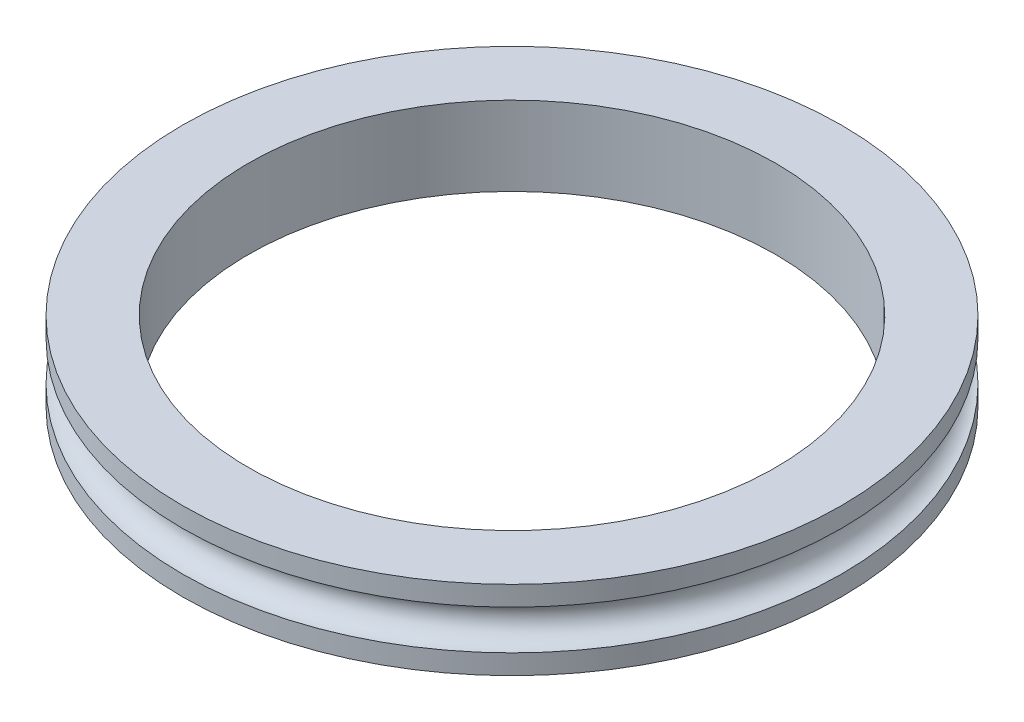
ISO-10303-21;
HEADER;
FILE_DESCRIPTION(('STEP AP214'),'2;1');
FILE_NAME('part.step','',(''),(''),'','','');
FILE_SCHEMA(('AUTOMOTIVE_DESIGN { 1 0 10303 214 1 1 1 1 }'));
ENDSEC;
DATA;
#1=APPLICATION_CONTEXT('core data for automotive mechanical design processes');
#2=APPLICATION_PROTOCOL_DEFINITION('international standard','automotive_design',2000,#1);
#3=PRODUCT_CONTEXT('',#1,'mechanical');
#4=PRODUCT('Part','Part','',(#3));
#5=PRODUCT_RELATED_PRODUCT_CATEGORY('part','',(#4));
#6=PRODUCT_DEFINITION_FORMATION('','',#4);
#7=PRODUCT_DEFINITION_CONTEXT('part definition',#1,'design');
#8=PRODUCT_DEFINITION('design','',#6,#7);
#9=PRODUCT_DEFINITION_SHAPE('','',#8);
#10=(LENGTH_UNIT() NAMED_UNIT(*) SI_UNIT(.MILLI.,.METRE.));
#11=(NAMED_UNIT(*) PLANE_ANGLE_UNIT() SI_UNIT($,.RADIAN.));
#12=(NAMED_UNIT(*) SI_UNIT($,.STERADIAN.) SOLID_ANGLE_UNIT());
#13=UNCERTAINTY_MEASURE_WITH_UNIT(LENGTH_MEASURE(1.E-05),#10,'distance_accuracy_value','');
#14=(GEOMETRIC_REPRESENTATION_CONTEXT(3) GLOBAL_UNCERTAINTY_ASSIGNED_CONTEXT((#13)) GLOBAL_UNIT_ASSIGNED_CONTEXT((#10,
#11,#12)) REPRESENTATION_CONTEXT('',''));
#15=CARTESIAN_POINT('',(0.,0.,0.));
#16=DIRECTION('',(0.,0.,1.));
#17=DIRECTION('',(1.,0.,0.));
#18=AXIS2_PLACEMENT_3D('',#15,#16,#17);
#19=CARTESIAN_POINT('',(0.,1.5,0.));
#20=DIRECTION('',(0.,-1.,0.));
#21=DIRECTION('',(0.,0.,-1.));
#22=AXIS2_PLACEMENT_3D('',#19,#20,#21);
#23=CYLINDRICAL_SURFACE('',#22,12.5);
#24=CARTESIAN_POINT('',(0.,1.5,0.));
#25=DIRECTION('',(0.,1.,0.));
#26=DIRECTION('',(0.,0.,1.));
#27=AXIS2_PLACEMENT_3D('',#24,#25,#26);
#28=CIRCLE('',#27,12.5);
#29=CARTESIAN_POINT('',(0.,1.5,12.5));
#30=VERTEX_POINT('',#29);
#31=EDGE_CURVE('E10',#30,#30,#28,.T.);
#32=ORIENTED_EDGE('',*,*,#31,.F.);
#33=EDGE_LOOP('',(#32));
#34=FACE_BOUND('',#33,.T.);
#35=CARTESIAN_POINT('',(0.,0.750000000000001,0.));
#36=DIRECTION('',(0.,-1.,0.));
#37=DIRECTION('',(0.,0.,-1.));
#38=AXIS2_PLACEMENT_3D('',#35,#36,#37);
#39=CIRCLE('',#38,12.5);
#40=CARTESIAN_POINT('',(0.,0.750000000000001,-12.5));
#41=VERTEX_POINT('',#40);
#42=EDGE_CURVE('E34',#41,#41,#39,.T.);
#43=ORIENTED_EDGE('',*,*,#42,.F.);
#44=EDGE_LOOP('',(#43));
#45=FACE_BOUND('',#44,.T.);
#46=ADVANCED_FACE('F31',(#34,#45),#23,.T.);
#47=CARTESIAN_POINT('',(0.,1.5,0.));
#48=DIRECTION('',(0.,1.,0.));
#49=DIRECTION('',(0.,0.,1.));
#50=AXIS2_PLACEMENT_3D('',#47,#48,#49);
#51=PLANE('',#50);
#52=CARTESIAN_POINT('',(0.,1.5,0.));
#53=DIRECTION('',(0.,-1.,0.));
#54=DIRECTION('',(0.,0.,-1.));
#55=AXIS2_PLACEMENT_3D('',#52,#53,#54);
#56=CIRCLE('',#55,10.);
#57=CARTESIAN_POINT('',(0.,1.5,-10.));
#58=VERTEX_POINT('',#57);
#59=EDGE_CURVE('E49',#58,#58,#56,.T.);
#60=ORIENTED_EDGE('',*,*,#59,.T.);
#61=EDGE_LOOP('',(#60));
#62=FACE_BOUND('',#61,.T.);
#63=ORIENTED_EDGE('',*,*,#31,.T.);
#64=EDGE_LOOP('',(#63));
#65=FACE_BOUND('',#64,.T.);
#66=ADVANCED_FACE('F76',(#62,#65),#51,.T.);
#67=CARTESIAN_POINT('',(0.,0.,0.));
#68=DIRECTION('',(0.,1.,0.));
#69=DIRECTION('',(0.,0.,1.));
#70=AXIS2_PLACEMENT_3D('',#67,#68,#69);
#71=TOROIDAL_SURFACE('',#70,12.5,0.75);
#72=CARTESIAN_POINT('',(0.,-0.75,0.));
#73=DIRECTION('',(0.,1.,0.));
#74=DIRECTION('',(0.,0.,1.));
#75=AXIS2_PLACEMENT_3D('',#72,#73,#74);
#76=CIRCLE('',#75,12.5);
#77=CARTESIAN_POINT('',(0.,-0.75,12.5));
#78=VERTEX_POINT('',#77);
#79=EDGE_CURVE('E47',#78,#78,#76,.T.);
#80=ORIENTED_EDGE('',*,*,#79,.T.);
#81=EDGE_LOOP('',(#80));
#82=FACE_BOUND('',#81,.T.);
#83=ORIENTED_EDGE('',*,*,#42,.T.);
#84=EDGE_LOOP('',(#83));
#85=FACE_BOUND('',#84,.T.);
#86=ADVANCED_FACE('F65',(#82,#85),#71,.F.);
#87=CARTESIAN_POINT('',(0.,-1.5,0.));
#88=DIRECTION('',(0.,1.,0.));
#89=DIRECTION('',(0.,0.,1.));
#90=AXIS2_PLACEMENT_3D('',#87,#88,#89);
#91=PLANE('',#90);
#92=CARTESIAN_POINT('',(0.,-1.5,0.));
#93=DIRECTION('',(0.,-1.,0.));
#94=DIRECTION('',(0.,0.,-1.));
#95=AXIS2_PLACEMENT_3D('',#92,#93,#94);
#96=CIRCLE('',#95,10.);
#97=CARTESIAN_POINT('',(0.,-1.5,-10.));
#98=VERTEX_POINT('',#97);
#99=EDGE_CURVE('E45',#98,#98,#96,.T.);
#100=ORIENTED_EDGE('',*,*,#99,.F.);
#101=EDGE_LOOP('',(#100));
#102=FACE_BOUND('',#101,.T.);
#103=CARTESIAN_POINT('',(0.,-1.5,0.));
#104=DIRECTION('',(0.,1.,0.));
#105=DIRECTION('',(0.,0.,1.));
#106=AXIS2_PLACEMENT_3D('',#103,#104,#105);
#107=CIRCLE('',#106,12.5);
#108=CARTESIAN_POINT('',(0.,-1.5,12.5));
#109=VERTEX_POINT('',#108);
#110=EDGE_CURVE('E38',#109,#109,#107,.T.);
#111=ORIENTED_EDGE('',*,*,#110,.F.);
#112=EDGE_LOOP('',(#111));
#113=FACE_BOUND('',#112,.T.);
#114=ADVANCED_FACE('F61',(#102,#113),#91,.F.);
#115=ORIENTED_EDGE('',*,*,#110,.T.);
#116=EDGE_LOOP('',(#115));
#117=FACE_BOUND('',#116,.T.);
#118=ORIENTED_EDGE('',*,*,#79,.F.);
#119=EDGE_LOOP('',(#118));
#120=FACE_BOUND('',#119,.T.);
#121=ADVANCED_FACE('F64',(#117,#120),#23,.T.);
#122=CARTESIAN_POINT('',(0.,1.5,0.));
#123=DIRECTION('',(0.,-1.,0.));
#124=DIRECTION('',(0.,0.,-1.));
#125=AXIS2_PLACEMENT_3D('',#122,#123,#124);
#126=CYLINDRICAL_SURFACE('',#125,10.);
#127=ORIENTED_EDGE('',*,*,#59,.F.);
#128=EDGE_LOOP('',(#127));
#129=FACE_BOUND('',#128,.T.);
#130=ORIENTED_EDGE('',*,*,#99,.T.);
#131=EDGE_LOOP('',(#130));
#132=FACE_BOUND('',#131,.T.);
#133=ADVANCED_FACE('F59',(#129,#132),#126,.F.);
#134=CLOSED_SHELL('',(#46,#66,#86,#114,#121,#133));
#135=MANIFOLD_SOLID_BREP('B2',#134);
#136=ADVANCED_BREP_SHAPE_REPRESENTATION('',(#18,#135),#14);
#137=SHAPE_DEFINITION_REPRESENTATION(#9,#136);
ENDSEC;
END-ISO-10303-21;
